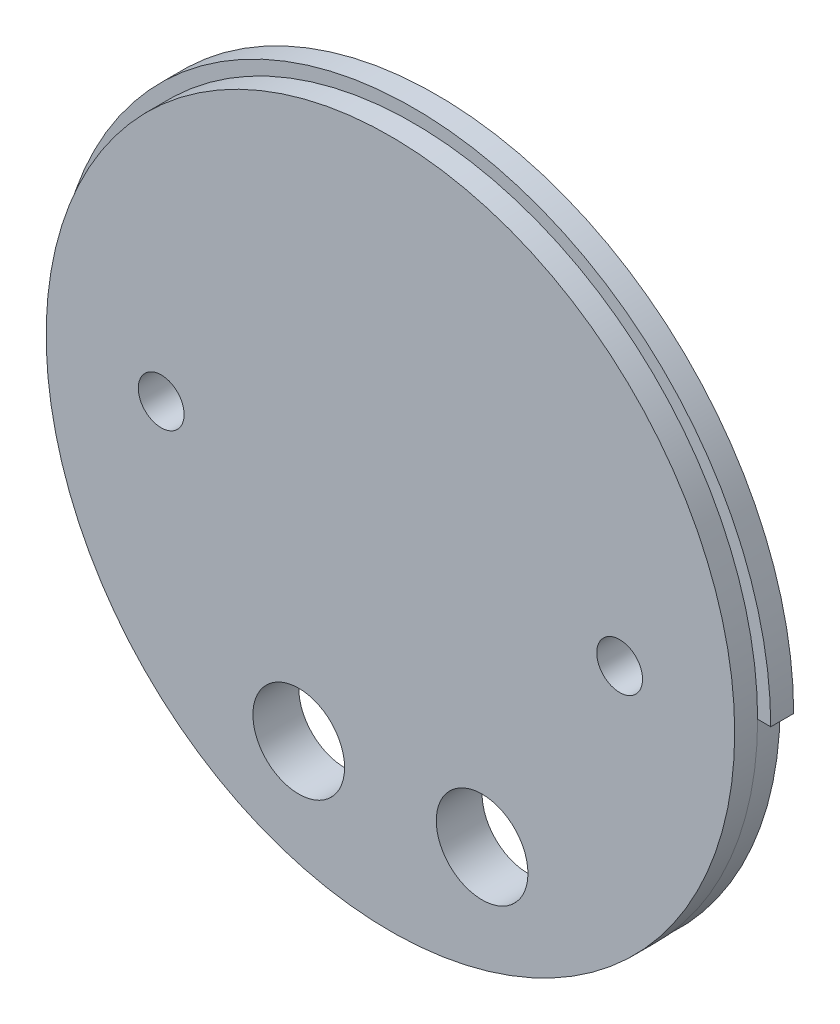
ISO-10303-21;
HEADER;
FILE_DESCRIPTION(('STEP AP214'),'2;1');
FILE_NAME('part.step','',(''),(''),'','','');
FILE_SCHEMA(('AUTOMOTIVE_DESIGN { 1 0 10303 214 1 1 1 1 }'));
ENDSEC;
DATA;
#1=APPLICATION_CONTEXT('core data for automotive mechanical design processes');
#2=APPLICATION_PROTOCOL_DEFINITION('international standard','automotive_design',2000,#1);
#3=PRODUCT_CONTEXT('',#1,'mechanical');
#4=PRODUCT('Part','Part','',(#3));
#5=PRODUCT_RELATED_PRODUCT_CATEGORY('part','',(#4));
#6=PRODUCT_DEFINITION_FORMATION('','',#4);
#7=PRODUCT_DEFINITION_CONTEXT('part definition',#1,'design');
#8=PRODUCT_DEFINITION('design','',#6,#7);
#9=PRODUCT_DEFINITION_SHAPE('','',#8);
#10=(LENGTH_UNIT() NAMED_UNIT(*) SI_UNIT(.MILLI.,.METRE.));
#11=(NAMED_UNIT(*) PLANE_ANGLE_UNIT() SI_UNIT($,.RADIAN.));
#12=(NAMED_UNIT(*) SI_UNIT($,.STERADIAN.) SOLID_ANGLE_UNIT());
#13=UNCERTAINTY_MEASURE_WITH_UNIT(LENGTH_MEASURE(1.E-05),#10,'distance_accuracy_value','');
#14=(GEOMETRIC_REPRESENTATION_CONTEXT(3) GLOBAL_UNCERTAINTY_ASSIGNED_CONTEXT((#13)) GLOBAL_UNIT_ASSIGNED_CONTEXT((#10,
#11,#12)) REPRESENTATION_CONTEXT('',''));
#15=CARTESIAN_POINT('',(0.,0.,0.));
#16=DIRECTION('',(0.,0.,1.));
#17=DIRECTION('',(1.,0.,0.));
#18=AXIS2_PLACEMENT_3D('',#15,#16,#17);
#19=CARTESIAN_POINT('',(0.,0.,3.175));
#20=DIRECTION('',(0.,0.,-1.));
#21=DIRECTION('',(-1.,0.,0.));
#22=AXIS2_PLACEMENT_3D('',#19,#20,#21);
#23=CYLINDRICAL_SURFACE('',#22,49.5046);
#24=CARTESIAN_POINT('',(0.,0.,3.175));
#25=DIRECTION('',(0.,0.,1.));
#26=DIRECTION('',(1.,0.,0.));
#27=AXIS2_PLACEMENT_3D('',#24,#25,#26);
#28=CIRCLE('',#27,49.5046);
#29=CARTESIAN_POINT('',(49.5046,0.,3.175));
#30=VERTEX_POINT('',#29);
#31=CARTESIAN_POINT('',(-49.5046,0.,3.175));
#32=VERTEX_POINT('',#31);
#33=EDGE_CURVE('E144',#30,#32,#28,.T.);
#34=ORIENTED_EDGE('',*,*,#33,.F.);
#35=DIRECTION('',(0.,0.,-1.));
#36=VECTOR('',#35,1.);
#37=CARTESIAN_POINT('',(49.5046,0.,3.175));
#38=LINE('',#37,#36);
#39=CARTESIAN_POINT('',(49.5046,0.,0.));
#40=VERTEX_POINT('',#39);
#41=EDGE_CURVE('E111',#30,#40,#38,.T.);
#42=ORIENTED_EDGE('',*,*,#41,.T.);
#43=CARTESIAN_POINT('',(0.,0.,0.));
#44=DIRECTION('',(0.,0.,1.));
#45=DIRECTION('',(1.,0.,0.));
#46=AXIS2_PLACEMENT_3D('',#43,#44,#45);
#47=CIRCLE('',#46,49.5046);
#48=CARTESIAN_POINT('',(-49.5046,0.,0.));
#49=VERTEX_POINT('',#48);
#50=EDGE_CURVE('E140',#40,#49,#47,.T.);
#51=ORIENTED_EDGE('',*,*,#50,.T.);
#52=DIRECTION('',(0.,0.,-1.));
#53=VECTOR('',#52,1.);
#54=CARTESIAN_POINT('',(-49.5046,0.,3.175));
#55=LINE('',#54,#53);
#56=EDGE_CURVE('E95',#49,#32,#55,.F.);
#57=ORIENTED_EDGE('',*,*,#56,.T.);
#58=EDGE_LOOP('',(#34,#42,#51,#57));
#59=FACE_BOUND('',#58,.T.);
#60=ADVANCED_FACE('F35',(#59),#23,.T.);
#61=CARTESIAN_POINT('',(0.,0.,3.175));
#62=DIRECTION('',(0.,0.,1.));
#63=DIRECTION('',(1.,0.,0.));
#64=AXIS2_PLACEMENT_3D('',#61,#62,#63);
#65=PLANE('',#64);
#66=DIRECTION('',(-1.,0.,0.));
#67=VECTOR('',#66,1.);
#68=CARTESIAN_POINT('',(47.625,0.,3.175));
#69=LINE('',#68,#67);
#70=CARTESIAN_POINT('',(47.6885,0.,3.175));
#71=VERTEX_POINT('',#70);
#72=EDGE_CURVE('E49',#30,#71,#69,.T.);
#73=ORIENTED_EDGE('',*,*,#72,.F.);
#74=ORIENTED_EDGE('',*,*,#33,.T.);
#75=DIRECTION('',(-1.,0.,0.));
#76=VECTOR('',#75,1.);
#77=CARTESIAN_POINT('',(-50.165,0.,3.175));
#78=LINE('',#77,#76);
#79=CARTESIAN_POINT('',(-47.6885,0.,3.175));
#80=VERTEX_POINT('',#79);
#81=EDGE_CURVE('E106',#80,#32,#78,.T.);
#82=ORIENTED_EDGE('',*,*,#81,.F.);
#83=CARTESIAN_POINT('',(0.,0.,3.175));
#84=DIRECTION('',(0.,0.,1.));
#85=DIRECTION('',(1.,0.,0.));
#86=AXIS2_PLACEMENT_3D('',#83,#84,#85);
#87=CIRCLE('',#86,47.6885);
#88=EDGE_CURVE('E42',#71,#80,#87,.T.);
#89=ORIENTED_EDGE('',*,*,#88,.F.);
#90=EDGE_LOOP('',(#73,#74,#82,#89));
#91=FACE_BOUND('',#90,.T.);
#92=ADVANCED_FACE('F151',(#91),#65,.T.);
#93=CARTESIAN_POINT('',(0.,0.,0.));
#94=DIRECTION('',(0.,0.,1.));
#95=DIRECTION('',(1.,0.,0.));
#96=AXIS2_PLACEMENT_3D('',#93,#94,#95);
#97=PLANE('',#96);
#98=CARTESIAN_POINT('',(-31.75,0.,0.));
#99=DIRECTION('',(0.,0.,1.));
#100=DIRECTION('',(1.,0.,0.));
#101=AXIS2_PLACEMENT_3D('',#98,#99,#100);
#102=CIRCLE('',#101,3.17500000000001);
#103=CARTESIAN_POINT('',(-28.575,0.,0.));
#104=VERTEX_POINT('',#103);
#105=EDGE_CURVE('E114',#104,#104,#102,.T.);
#106=ORIENTED_EDGE('',*,*,#105,.T.);
#107=EDGE_LOOP('',(#106));
#108=FACE_BOUND('',#107,.T.);
#109=CARTESIAN_POINT('',(12.7,-31.2353524431853,0.));
#110=DIRECTION('',(0.,0.,1.));
#111=DIRECTION('',(1.,0.,0.));
#112=AXIS2_PLACEMENT_3D('',#109,#110,#111);
#113=CIRCLE('',#112,6.35);
#114=CARTESIAN_POINT('',(19.05,-31.2353524431853,0.));
#115=VERTEX_POINT('',#114);
#116=EDGE_CURVE('E122',#115,#115,#113,.T.);
#117=ORIENTED_EDGE('',*,*,#116,.T.);
#118=EDGE_LOOP('',(#117));
#119=FACE_BOUND('',#118,.T.);
#120=CARTESIAN_POINT('',(-12.7,-31.2353524431853,0.));
#121=DIRECTION('',(0.,0.,1.));
#122=DIRECTION('',(1.,0.,0.));
#123=AXIS2_PLACEMENT_3D('',#120,#121,#122);
#124=CIRCLE('',#123,6.35);
#125=CARTESIAN_POINT('',(-6.35,-31.2353524431853,0.));
#126=VERTEX_POINT('',#125);
#127=EDGE_CURVE('E133',#126,#126,#124,.T.);
#128=ORIENTED_EDGE('',*,*,#127,.T.);
#129=EDGE_LOOP('',(#128));
#130=FACE_BOUND('',#129,.T.);
#131=CARTESIAN_POINT('',(31.75,0.,0.));
#132=DIRECTION('',(0.,0.,1.));
#133=DIRECTION('',(1.,0.,0.));
#134=AXIS2_PLACEMENT_3D('',#131,#132,#133);
#135=CIRCLE('',#134,3.17500000000001);
#136=CARTESIAN_POINT('',(34.925,0.,0.));
#137=VERTEX_POINT('',#136);
#138=EDGE_CURVE('E121',#137,#137,#135,.T.);
#139=ORIENTED_EDGE('',*,*,#138,.T.);
#140=EDGE_LOOP('',(#139));
#141=FACE_BOUND('',#140,.T.);
#142=ORIENTED_EDGE('',*,*,#50,.F.);
#143=DIRECTION('',(-1.,0.,0.));
#144=VECTOR('',#143,1.);
#145=CARTESIAN_POINT('',(0.,0.,0.));
#146=LINE('',#145,#144);
#147=CARTESIAN_POINT('',(47.625,0.,0.));
#148=VERTEX_POINT('',#147);
#149=EDGE_CURVE('E11',#40,#148,#146,.T.);
#150=ORIENTED_EDGE('',*,*,#149,.T.);
#151=CARTESIAN_POINT('',(0.,0.,0.));
#152=DIRECTION('',(0.,0.,-1.));
#153=DIRECTION('',(1.,0.,0.));
#154=AXIS2_PLACEMENT_3D('',#151,#152,#153);
#155=CIRCLE('',#154,47.625);
#156=CARTESIAN_POINT('',(-47.625,0.,0.));
#157=VERTEX_POINT('',#156);
#158=EDGE_CURVE('E83',#148,#157,#155,.T.);
#159=ORIENTED_EDGE('',*,*,#158,.T.);
#160=DIRECTION('',(-1.,0.,0.));
#161=VECTOR('',#160,1.);
#162=CARTESIAN_POINT('',(-50.165,0.,0.));
#163=LINE('',#162,#161);
#164=EDGE_CURVE('E90',#157,#49,#163,.T.);
#165=ORIENTED_EDGE('',*,*,#164,.T.);
#166=EDGE_LOOP('',(#142,#150,#159,#165));
#167=FACE_BOUND('',#166,.T.);
#168=ADVANCED_FACE('F100',(#108,#119,#130,#141,#167),#97,.F.);
#169=CARTESIAN_POINT('',(0.,0.,6.35));
#170=DIRECTION('',(0.,0.,-1.));
#171=DIRECTION('',(-1.,0.,0.));
#172=AXIS2_PLACEMENT_3D('',#169,#170,#171);
#173=CYLINDRICAL_SURFACE('',#172,47.6885);
#174=CARTESIAN_POINT('',(0.,0.,6.35));
#175=DIRECTION('',(0.,0.,1.));
#176=DIRECTION('',(1.,0.,0.));
#177=AXIS2_PLACEMENT_3D('',#174,#175,#176);
#178=CIRCLE('',#177,47.6885);
#179=CARTESIAN_POINT('',(47.6885,0.,6.35));
#180=VERTEX_POINT('',#179);
#181=EDGE_CURVE('E117',#180,#180,#178,.T.);
#182=ORIENTED_EDGE('',*,*,#181,.F.);
#183=EDGE_LOOP('',(#182));
#184=FACE_BOUND('',#183,.T.);
#185=ORIENTED_EDGE('',*,*,#88,.T.);
#186=EDGE_CURVE('E143',#80,#71,#87,.T.);
#187=ORIENTED_EDGE('',*,*,#186,.T.);
#188=EDGE_LOOP('',(#185,#187));
#189=FACE_BOUND('',#188,.T.);
#190=ADVANCED_FACE('F155',(#184,#189),#173,.T.);
#191=CARTESIAN_POINT('',(0.,0.,6.35));
#192=DIRECTION('',(0.,0.,1.));
#193=DIRECTION('',(1.,0.,0.));
#194=AXIS2_PLACEMENT_3D('',#191,#192,#193);
#195=PLANE('',#194);
#196=CARTESIAN_POINT('',(-31.75,0.,6.35));
#197=DIRECTION('',(0.,0.,1.));
#198=DIRECTION('',(1.,0.,0.));
#199=AXIS2_PLACEMENT_3D('',#196,#197,#198);
#200=CIRCLE('',#199,3.17500000000001);
#201=CARTESIAN_POINT('',(-28.575,0.,6.35));
#202=VERTEX_POINT('',#201);
#203=EDGE_CURVE('E118',#202,#202,#200,.T.);
#204=ORIENTED_EDGE('',*,*,#203,.F.);
#205=EDGE_LOOP('',(#204));
#206=FACE_BOUND('',#205,.T.);
#207=CARTESIAN_POINT('',(12.7,-31.2353524431853,6.35));
#208=DIRECTION('',(0.,0.,1.));
#209=DIRECTION('',(1.,0.,0.));
#210=AXIS2_PLACEMENT_3D('',#207,#208,#209);
#211=CIRCLE('',#210,6.35);
#212=CARTESIAN_POINT('',(19.05,-31.2353524431853,6.35));
#213=VERTEX_POINT('',#212);
#214=EDGE_CURVE('E113',#213,#213,#211,.T.);
#215=ORIENTED_EDGE('',*,*,#214,.F.);
#216=EDGE_LOOP('',(#215));
#217=FACE_BOUND('',#216,.T.);
#218=CARTESIAN_POINT('',(-12.7,-31.2353524431853,6.35));
#219=DIRECTION('',(0.,0.,1.));
#220=DIRECTION('',(1.,0.,0.));
#221=AXIS2_PLACEMENT_3D('',#218,#219,#220);
#222=CIRCLE('',#221,6.35);
#223=CARTESIAN_POINT('',(-6.35,-31.2353524431853,6.35));
#224=VERTEX_POINT('',#223);
#225=EDGE_CURVE('E125',#224,#224,#222,.T.);
#226=ORIENTED_EDGE('',*,*,#225,.F.);
#227=EDGE_LOOP('',(#226));
#228=FACE_BOUND('',#227,.T.);
#229=CARTESIAN_POINT('',(31.75,0.,6.35));
#230=DIRECTION('',(0.,0.,1.));
#231=DIRECTION('',(1.,0.,0.));
#232=AXIS2_PLACEMENT_3D('',#229,#230,#231);
#233=CIRCLE('',#232,3.17500000000001);
#234=CARTESIAN_POINT('',(34.925,0.,6.35));
#235=VERTEX_POINT('',#234);
#236=EDGE_CURVE('E130',#235,#235,#233,.T.);
#237=ORIENTED_EDGE('',*,*,#236,.F.);
#238=EDGE_LOOP('',(#237));
#239=FACE_BOUND('',#238,.T.);
#240=ORIENTED_EDGE('',*,*,#181,.T.);
#241=EDGE_LOOP('',(#240));
#242=FACE_BOUND('',#241,.T.);
#243=ADVANCED_FACE('F179',(#206,#217,#228,#239,#242),#195,.T.);
#244=CARTESIAN_POINT('',(31.75,0.,0.));
#245=DIRECTION('',(0.,0.,1.));
#246=DIRECTION('',(1.,0.,0.));
#247=AXIS2_PLACEMENT_3D('',#244,#245,#246);
#248=CYLINDRICAL_SURFACE('',#247,3.17500000000001);
#249=ORIENTED_EDGE('',*,*,#138,.F.);
#250=EDGE_LOOP('',(#249));
#251=FACE_BOUND('',#250,.T.);
#252=ORIENTED_EDGE('',*,*,#236,.T.);
#253=EDGE_LOOP('',(#252));
#254=FACE_BOUND('',#253,.T.);
#255=ADVANCED_FACE('F183',(#251,#254),#248,.F.);
#256=CARTESIAN_POINT('',(-12.7,-31.2353524431853,0.));
#257=DIRECTION('',(0.,0.,1.));
#258=DIRECTION('',(1.,0.,0.));
#259=AXIS2_PLACEMENT_3D('',#256,#257,#258);
#260=CYLINDRICAL_SURFACE('',#259,6.35);
#261=ORIENTED_EDGE('',*,*,#127,.F.);
#262=EDGE_LOOP('',(#261));
#263=FACE_BOUND('',#262,.T.);
#264=ORIENTED_EDGE('',*,*,#225,.T.);
#265=EDGE_LOOP('',(#264));
#266=FACE_BOUND('',#265,.T.);
#267=ADVANCED_FACE('F185',(#263,#266),#260,.F.);
#268=CARTESIAN_POINT('',(12.7,-31.2353524431853,0.));
#269=DIRECTION('',(0.,0.,1.));
#270=DIRECTION('',(1.,0.,0.));
#271=AXIS2_PLACEMENT_3D('',#268,#269,#270);
#272=CYLINDRICAL_SURFACE('',#271,6.35);
#273=ORIENTED_EDGE('',*,*,#116,.F.);
#274=EDGE_LOOP('',(#273));
#275=FACE_BOUND('',#274,.T.);
#276=ORIENTED_EDGE('',*,*,#214,.T.);
#277=EDGE_LOOP('',(#276));
#278=FACE_BOUND('',#277,.T.);
#279=ADVANCED_FACE('F188',(#275,#278),#272,.F.);
#280=CARTESIAN_POINT('',(-31.75,0.,0.));
#281=DIRECTION('',(0.,0.,1.));
#282=DIRECTION('',(1.,0.,0.));
#283=AXIS2_PLACEMENT_3D('',#280,#281,#282);
#284=CYLINDRICAL_SURFACE('',#283,3.17500000000001);
#285=ORIENTED_EDGE('',*,*,#105,.F.);
#286=EDGE_LOOP('',(#285));
#287=FACE_BOUND('',#286,.T.);
#288=ORIENTED_EDGE('',*,*,#203,.T.);
#289=EDGE_LOOP('',(#288));
#290=FACE_BOUND('',#289,.T.);
#291=ADVANCED_FACE('F195',(#287,#290),#284,.F.);
#292=CARTESIAN_POINT('',(47.625,0.,0.));
#293=DIRECTION('',(0.,1.,0.));
#294=DIRECTION('',(0.,0.,1.));
#295=AXIS2_PLACEMENT_3D('',#292,#293,#294);
#296=PLANE('',#295);
#297=ORIENTED_EDGE('',*,*,#72,.T.);
#298=CARTESIAN_POINT('',(47.625,0.,3.175));
#299=VERTEX_POINT('',#298);
#300=EDGE_CURVE('E102',#71,#299,#69,.T.);
#301=ORIENTED_EDGE('',*,*,#300,.T.);
#302=DIRECTION('',(0.,0.,1.));
#303=VECTOR('',#302,1.);
#304=CARTESIAN_POINT('',(47.625,0.,0.));
#305=LINE('',#304,#303);
#306=EDGE_CURVE('E89',#148,#299,#305,.T.);
#307=ORIENTED_EDGE('',*,*,#306,.F.);
#308=ORIENTED_EDGE('',*,*,#149,.F.);
#309=ORIENTED_EDGE('',*,*,#41,.F.);
#310=EDGE_LOOP('',(#297,#301,#307,#308,#309));
#311=FACE_BOUND('',#310,.T.);
#312=ADVANCED_FACE('F148',(#311),#296,.F.);
#313=CARTESIAN_POINT('',(-50.165,0.,0.));
#314=DIRECTION('',(0.,1.,0.));
#315=DIRECTION('',(0.,0.,1.));
#316=AXIS2_PLACEMENT_3D('',#313,#314,#315);
#317=PLANE('',#316);
#318=ORIENTED_EDGE('',*,*,#164,.F.);
#319=DIRECTION('',(0.,0.,1.));
#320=VECTOR('',#319,1.);
#321=CARTESIAN_POINT('',(-47.625,0.,0.));
#322=LINE('',#321,#320);
#323=CARTESIAN_POINT('',(-47.625,0.,3.175));
#324=VERTEX_POINT('',#323);
#325=EDGE_CURVE('E78',#157,#324,#322,.T.);
#326=ORIENTED_EDGE('',*,*,#325,.T.);
#327=EDGE_CURVE('E107',#324,#80,#78,.T.);
#328=ORIENTED_EDGE('',*,*,#327,.T.);
#329=ORIENTED_EDGE('',*,*,#81,.T.);
#330=ORIENTED_EDGE('',*,*,#56,.F.);
#331=EDGE_LOOP('',(#318,#326,#328,#329,#330));
#332=FACE_BOUND('',#331,.T.);
#333=ADVANCED_FACE('F93',(#332),#317,.F.);
#334=CARTESIAN_POINT('',(0.,0.,3.175));
#335=DIRECTION('',(0.,0.,1.));
#336=DIRECTION('',(1.,0.,0.));
#337=AXIS2_PLACEMENT_3D('',#334,#335,#336);
#338=PLANE('',#337);
#339=ORIENTED_EDGE('',*,*,#327,.F.);
#340=CARTESIAN_POINT('',(0.,0.,3.175));
#341=DIRECTION('',(0.,0.,-1.));
#342=DIRECTION('',(1.,0.,0.));
#343=AXIS2_PLACEMENT_3D('',#340,#341,#342);
#344=CIRCLE('',#343,47.625);
#345=EDGE_CURVE('E85',#299,#324,#344,.T.);
#346=ORIENTED_EDGE('',*,*,#345,.F.);
#347=ORIENTED_EDGE('',*,*,#300,.F.);
#348=ORIENTED_EDGE('',*,*,#186,.F.);
#349=EDGE_LOOP('',(#339,#346,#347,#348));
#350=FACE_BOUND('',#349,.T.);
#351=ADVANCED_FACE('F157',(#350),#338,.F.);
#352=CARTESIAN_POINT('',(0.,0.,0.));
#353=DIRECTION('',(0.,0.,1.));
#354=DIRECTION('',(1.,0.,0.));
#355=AXIS2_PLACEMENT_3D('',#352,#353,#354);
#356=CYLINDRICAL_SURFACE('',#355,47.625);
#357=ORIENTED_EDGE('',*,*,#345,.T.);
#358=ORIENTED_EDGE('',*,*,#325,.F.);
#359=ORIENTED_EDGE('',*,*,#158,.F.);
#360=ORIENTED_EDGE('',*,*,#306,.T.);
#361=EDGE_LOOP('',(#357,#358,#359,#360));
#362=FACE_BOUND('',#361,.T.);
#363=ADVANCED_FACE('F80',(#362),#356,.T.);
#364=CLOSED_SHELL('',(#60,#92,#168,#190,#243,#255,#267,#279,#291,#312,#333,#351,#363));
#365=MANIFOLD_SOLID_BREP('B2',#364);
#366=ADVANCED_BREP_SHAPE_REPRESENTATION('',(#18,#365),#14);
#367=SHAPE_DEFINITION_REPRESENTATION(#9,#366);
ENDSEC;
END-ISO-10303-21;
